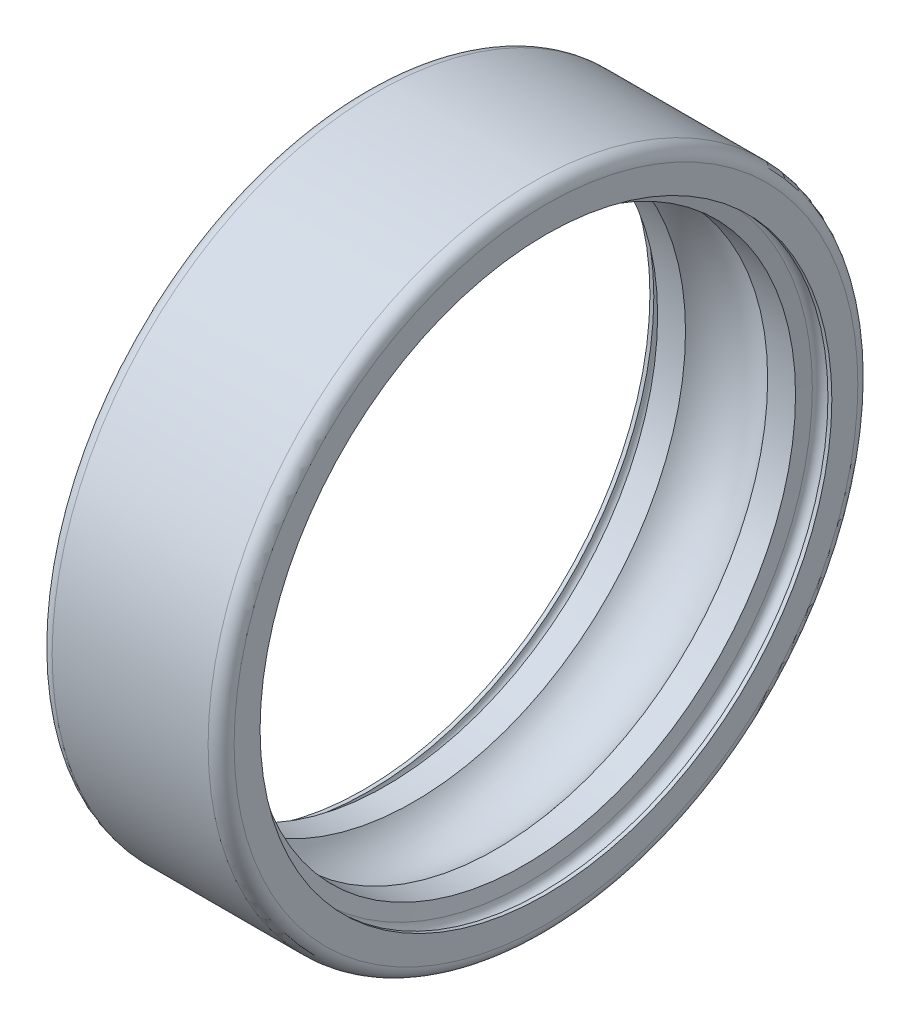
ISO-10303-21;
HEADER;
FILE_DESCRIPTION(('STEP AP214'),'2;1');
FILE_NAME('part.step','',(''),(''),'','','');
FILE_SCHEMA(('AUTOMOTIVE_DESIGN { 1 0 10303 214 1 1 1 1 }'));
ENDSEC;
DATA;
#1=APPLICATION_CONTEXT('core data for automotive mechanical design processes');
#2=APPLICATION_PROTOCOL_DEFINITION('international standard','automotive_design',2000,#1);
#3=PRODUCT_CONTEXT('',#1,'mechanical');
#4=PRODUCT('Part','Part','',(#3));
#5=PRODUCT_RELATED_PRODUCT_CATEGORY('part','',(#4));
#6=PRODUCT_DEFINITION_FORMATION('','',#4);
#7=PRODUCT_DEFINITION_CONTEXT('part definition',#1,'design');
#8=PRODUCT_DEFINITION('design','',#6,#7);
#9=PRODUCT_DEFINITION_SHAPE('','',#8);
#10=(LENGTH_UNIT() NAMED_UNIT(*) SI_UNIT(.MILLI.,.METRE.));
#11=(NAMED_UNIT(*) PLANE_ANGLE_UNIT() SI_UNIT($,.RADIAN.));
#12=(NAMED_UNIT(*) SI_UNIT($,.STERADIAN.) SOLID_ANGLE_UNIT());
#13=UNCERTAINTY_MEASURE_WITH_UNIT(LENGTH_MEASURE(1.E-05),#10,'distance_accuracy_value','');
#14=(GEOMETRIC_REPRESENTATION_CONTEXT(3) GLOBAL_UNCERTAINTY_ASSIGNED_CONTEXT((#13)) GLOBAL_UNIT_ASSIGNED_CONTEXT((#10,
#11,#12)) REPRESENTATION_CONTEXT('',''));
#15=CARTESIAN_POINT('',(0.,0.,0.));
#16=DIRECTION('',(0.,0.,1.));
#17=DIRECTION('',(1.,0.,0.));
#18=AXIS2_PLACEMENT_3D('',#15,#16,#17);
#19=CARTESIAN_POINT('',(0.,23.9999999999992,0.));
#20=DIRECTION('',(1.,0.,0.));
#21=DIRECTION('',(0.,0.,-1.));
#22=AXIS2_PLACEMENT_3D('',#19,#20,#21);
#23=PLANE('',#22);
#24=CARTESIAN_POINT('',(0.,0.,0.));
#25=DIRECTION('',(-1.,0.,0.));
#26=DIRECTION('',(0.,0.,1.));
#27=AXIS2_PLACEMENT_3D('',#24,#25,#26);
#28=CIRCLE('',#27,22.);
#29=CARTESIAN_POINT('',(0.,0.,22.));
#30=VERTEX_POINT('',#29);
#31=EDGE_CURVE('E10',#30,#30,#28,.T.);
#32=ORIENTED_EDGE('',*,*,#31,.F.);
#33=EDGE_LOOP('',(#32));
#34=FACE_BOUND('',#33,.T.);
#35=CARTESIAN_POINT('',(0.,0.,0.));
#36=DIRECTION('',(-1.,0.,0.));
#37=DIRECTION('',(0.,0.,1.));
#38=AXIS2_PLACEMENT_3D('',#35,#36,#37);
#39=CIRCLE('',#38,23.9999999999992);
#40=CARTESIAN_POINT('',(0.,0.,23.9999999999992));
#41=VERTEX_POINT('',#40);
#42=EDGE_CURVE('E81',#41,#41,#39,.T.);
#43=ORIENTED_EDGE('',*,*,#42,.T.);
#44=EDGE_LOOP('',(#43));
#45=FACE_BOUND('',#44,.T.);
#46=ADVANCED_FACE('F35',(#34,#45),#23,.F.);
#47=CARTESIAN_POINT('',(50.,0.,0.));
#48=DIRECTION('',(-1.,0.,0.));
#49=DIRECTION('',(0.,0.,1.));
#50=AXIS2_PLACEMENT_3D('',#47,#48,#49);
#51=CYLINDRICAL_SURFACE('',#50,22.);
#52=CARTESIAN_POINT('',(0.300000000000002,0.,0.));
#53=DIRECTION('',(-1.,0.,0.));
#54=DIRECTION('',(0.,0.,1.));
#55=AXIS2_PLACEMENT_3D('',#52,#53,#54);
#56=CIRCLE('',#55,22.);
#57=CARTESIAN_POINT('',(0.300000000000002,0.,22.));
#58=VERTEX_POINT('',#57);
#59=EDGE_CURVE('E41',#58,#58,#56,.T.);
#60=ORIENTED_EDGE('',*,*,#59,.F.);
#61=EDGE_LOOP('',(#60));
#62=FACE_BOUND('',#61,.T.);
#63=ORIENTED_EDGE('',*,*,#31,.T.);
#64=EDGE_LOOP('',(#63));
#65=FACE_BOUND('',#64,.T.);
#66=ADVANCED_FACE('F154',(#62,#65),#51,.F.);
#67=CARTESIAN_POINT('',(0.9,0.,0.));
#68=DIRECTION('',(-1.,0.,0.));
#69=DIRECTION('',(0.,0.,1.));
#70=AXIS2_PLACEMENT_3D('',#67,#68,#69);
#71=TOROIDAL_SURFACE('',#70,22.,0.6);
#72=CARTESIAN_POINT('',(1.5,0.,0.));
#73=DIRECTION('',(-1.,0.,0.));
#74=DIRECTION('',(0.,0.,1.));
#75=AXIS2_PLACEMENT_3D('',#72,#73,#74);
#76=CIRCLE('',#75,22.);
#77=CARTESIAN_POINT('',(1.5,0.,22.));
#78=VERTEX_POINT('',#77);
#79=EDGE_CURVE('E45',#78,#78,#76,.T.);
#80=ORIENTED_EDGE('',*,*,#79,.F.);
#81=EDGE_LOOP('',(#80));
#82=FACE_BOUND('',#81,.T.);
#83=ORIENTED_EDGE('',*,*,#59,.T.);
#84=EDGE_LOOP('',(#83));
#85=FACE_BOUND('',#84,.T.);
#86=ADVANCED_FACE('F149',(#82,#85),#71,.F.);
#87=CARTESIAN_POINT('',(1.5,0.,0.));
#88=DIRECTION('',(-1.,0.,0.));
#89=DIRECTION('',(0.,0.,1.));
#90=AXIS2_PLACEMENT_3D('',#87,#88,#89);
#91=CONICAL_SURFACE('',#90,22.,1.39626340159548);
#92=CARTESIAN_POINT('',(1.6939596787793,0.,0.));
#93=DIRECTION('',(-1.,0.,0.));
#94=DIRECTION('',(0.,0.,1.));
#95=AXIS2_PLACEMENT_3D('',#92,#93,#94);
#96=CIRCLE('',#95,20.9);
#97=CARTESIAN_POINT('',(1.6939596787793,0.,20.9));
#98=VERTEX_POINT('',#97);
#99=EDGE_CURVE('E49',#98,#98,#96,.T.);
#100=ORIENTED_EDGE('',*,*,#99,.F.);
#101=EDGE_LOOP('',(#100));
#102=FACE_BOUND('',#101,.T.);
#103=ORIENTED_EDGE('',*,*,#79,.T.);
#104=EDGE_LOOP('',(#103));
#105=FACE_BOUND('',#104,.T.);
#106=ADVANCED_FACE('F143',(#102,#105),#91,.F.);
#107=CARTESIAN_POINT('',(50.,0.,0.));
#108=DIRECTION('',(-1.,0.,0.));
#109=DIRECTION('',(0.,0.,1.));
#110=AXIS2_PLACEMENT_3D('',#107,#108,#109);
#111=CYLINDRICAL_SURFACE('',#110,20.9);
#112=CARTESIAN_POINT('',(3.8388354993769,0.,0.));
#113=DIRECTION('',(-1.,0.,0.));
#114=DIRECTION('',(0.,0.,1.));
#115=AXIS2_PLACEMENT_3D('',#112,#113,#114);
#116=CIRCLE('',#115,20.9);
#117=CARTESIAN_POINT('',(3.8388354993769,0.,20.9));
#118=VERTEX_POINT('',#117);
#119=EDGE_CURVE('E54',#118,#118,#116,.T.);
#120=ORIENTED_EDGE('',*,*,#119,.F.);
#121=EDGE_LOOP('',(#120));
#122=FACE_BOUND('',#121,.T.);
#123=ORIENTED_EDGE('',*,*,#99,.T.);
#124=EDGE_LOOP('',(#123));
#125=FACE_BOUND('',#124,.T.);
#126=ADVANCED_FACE('F137',(#122,#125),#111,.F.);
#127=CARTESIAN_POINT('',(6.99999999999995,0.,0.));
#128=DIRECTION('',(-1.,0.,0.));
#129=DIRECTION('',(0.,0.,1.));
#130=AXIS2_PLACEMENT_3D('',#127,#128,#129);
#131=TOROIDAL_SURFACE('',#130,18.5000000000002,3.9689999999998);
#132=CARTESIAN_POINT('',(10.161164500623,0.,0.));
#133=DIRECTION('',(-1.,0.,0.));
#134=DIRECTION('',(0.,0.,1.));
#135=AXIS2_PLACEMENT_3D('',#132,#133,#134);
#136=CIRCLE('',#135,20.9);
#137=CARTESIAN_POINT('',(10.161164500623,0.,20.9));
#138=VERTEX_POINT('',#137);
#139=EDGE_CURVE('E57',#138,#138,#136,.T.);
#140=ORIENTED_EDGE('',*,*,#139,.F.);
#141=EDGE_LOOP('',(#140));
#142=FACE_BOUND('',#141,.T.);
#143=ORIENTED_EDGE('',*,*,#119,.T.);
#144=EDGE_LOOP('',(#143));
#145=FACE_BOUND('',#144,.T.);
#146=ADVANCED_FACE('F131',(#142,#145),#131,.F.);
#147=CARTESIAN_POINT('',(50.,0.,0.));
#148=DIRECTION('',(-1.,0.,0.));
#149=DIRECTION('',(0.,0.,1.));
#150=AXIS2_PLACEMENT_3D('',#147,#148,#149);
#151=CYLINDRICAL_SURFACE('',#150,20.9);
#152=CARTESIAN_POINT('',(12.306040321221,0.,0.));
#153=DIRECTION('',(-1.,0.,0.));
#154=DIRECTION('',(0.,0.,1.));
#155=AXIS2_PLACEMENT_3D('',#152,#153,#154);
#156=CIRCLE('',#155,20.9);
#157=CARTESIAN_POINT('',(12.306040321221,0.,20.9));
#158=VERTEX_POINT('',#157);
#159=EDGE_CURVE('E60',#158,#158,#156,.T.);
#160=ORIENTED_EDGE('',*,*,#159,.F.);
#161=EDGE_LOOP('',(#160));
#162=FACE_BOUND('',#161,.T.);
#163=ORIENTED_EDGE('',*,*,#139,.T.);
#164=EDGE_LOOP('',(#163));
#165=FACE_BOUND('',#164,.T.);
#166=ADVANCED_FACE('F125',(#162,#165),#151,.F.);
#167=CARTESIAN_POINT('',(12.306040321221,0.,0.));
#168=DIRECTION('',(1.,0.,0.));
#169=DIRECTION('',(0.,0.,-1.));
#170=AXIS2_PLACEMENT_3D('',#167,#168,#169);
#171=CONICAL_SURFACE('',#170,20.9,1.39626340159574);
#172=CARTESIAN_POINT('',(12.5,0.,0.));
#173=DIRECTION('',(-1.,0.,0.));
#174=DIRECTION('',(0.,0.,1.));
#175=AXIS2_PLACEMENT_3D('',#172,#173,#174);
#176=CIRCLE('',#175,22.);
#177=CARTESIAN_POINT('',(12.5,0.,22.));
#178=VERTEX_POINT('',#177);
#179=EDGE_CURVE('E63',#178,#178,#176,.T.);
#180=ORIENTED_EDGE('',*,*,#179,.F.);
#181=EDGE_LOOP('',(#180));
#182=FACE_BOUND('',#181,.T.);
#183=ORIENTED_EDGE('',*,*,#159,.T.);
#184=EDGE_LOOP('',(#183));
#185=FACE_BOUND('',#184,.T.);
#186=ADVANCED_FACE('F119',(#182,#185),#171,.F.);
#187=CARTESIAN_POINT('',(13.1,0.,0.));
#188=DIRECTION('',(-1.,0.,0.));
#189=DIRECTION('',(0.,0.,1.));
#190=AXIS2_PLACEMENT_3D('',#187,#188,#189);
#191=TOROIDAL_SURFACE('',#190,22.,0.600000000000001);
#192=CARTESIAN_POINT('',(13.7,0.,0.));
#193=DIRECTION('',(-1.,0.,0.));
#194=DIRECTION('',(0.,0.,1.));
#195=AXIS2_PLACEMENT_3D('',#192,#193,#194);
#196=CIRCLE('',#195,22.);
#197=CARTESIAN_POINT('',(13.7,0.,22.));
#198=VERTEX_POINT('',#197);
#199=EDGE_CURVE('E66',#198,#198,#196,.T.);
#200=ORIENTED_EDGE('',*,*,#199,.F.);
#201=EDGE_LOOP('',(#200));
#202=FACE_BOUND('',#201,.T.);
#203=ORIENTED_EDGE('',*,*,#179,.T.);
#204=EDGE_LOOP('',(#203));
#205=FACE_BOUND('',#204,.T.);
#206=ADVANCED_FACE('F113',(#202,#205),#191,.F.);
#207=CARTESIAN_POINT('',(50.,0.,0.));
#208=DIRECTION('',(-1.,0.,0.));
#209=DIRECTION('',(0.,0.,1.));
#210=AXIS2_PLACEMENT_3D('',#207,#208,#209);
#211=CYLINDRICAL_SURFACE('',#210,22.);
#212=CARTESIAN_POINT('',(14.,0.,0.));
#213=DIRECTION('',(-1.,0.,0.));
#214=DIRECTION('',(0.,0.,1.));
#215=AXIS2_PLACEMENT_3D('',#212,#213,#214);
#216=CIRCLE('',#215,22.);
#217=CARTESIAN_POINT('',(14.,0.,22.));
#218=VERTEX_POINT('',#217);
#219=EDGE_CURVE('E69',#218,#218,#216,.T.);
#220=ORIENTED_EDGE('',*,*,#219,.F.);
#221=EDGE_LOOP('',(#220));
#222=FACE_BOUND('',#221,.T.);
#223=ORIENTED_EDGE('',*,*,#199,.T.);
#224=EDGE_LOOP('',(#223));
#225=FACE_BOUND('',#224,.T.);
#226=ADVANCED_FACE('F107',(#222,#225),#211,.F.);
#227=CARTESIAN_POINT('',(14.,22.,0.));
#228=DIRECTION('',(-1.,0.,0.));
#229=DIRECTION('',(0.,0.,1.));
#230=AXIS2_PLACEMENT_3D('',#227,#228,#229);
#231=PLANE('',#230);
#232=CARTESIAN_POINT('',(14.,0.,0.));
#233=DIRECTION('',(-1.,0.,0.));
#234=DIRECTION('',(0.,0.,1.));
#235=AXIS2_PLACEMENT_3D('',#232,#233,#234);
#236=CIRCLE('',#235,24.);
#237=CARTESIAN_POINT('',(14.,0.,24.));
#238=VERTEX_POINT('',#237);
#239=EDGE_CURVE('E72',#238,#238,#236,.T.);
#240=ORIENTED_EDGE('',*,*,#239,.F.);
#241=EDGE_LOOP('',(#240));
#242=FACE_BOUND('',#241,.T.);
#243=ORIENTED_EDGE('',*,*,#219,.T.);
#244=EDGE_LOOP('',(#243));
#245=FACE_BOUND('',#244,.T.);
#246=ADVANCED_FACE('F101',(#242,#245),#231,.F.);
#247=CARTESIAN_POINT('',(13.0000000000016,0.,0.));
#248=DIRECTION('',(-1.,0.,0.));
#249=DIRECTION('',(0.,0.,1.));
#250=AXIS2_PLACEMENT_3D('',#247,#248,#249);
#251=TOROIDAL_SURFACE('',#250,24.0000000000015,0.999999999998452);
#252=CARTESIAN_POINT('',(13.,0.,0.));
#253=DIRECTION('',(-1.,0.,0.));
#254=DIRECTION('',(0.,0.,1.));
#255=AXIS2_PLACEMENT_3D('',#252,#253,#254);
#256=CIRCLE('',#255,25.);
#257=CARTESIAN_POINT('',(13.,0.,25.));
#258=VERTEX_POINT('',#257);
#259=EDGE_CURVE('E75',#258,#258,#256,.T.);
#260=ORIENTED_EDGE('',*,*,#259,.F.);
#261=EDGE_LOOP('',(#260));
#262=FACE_BOUND('',#261,.T.);
#263=ORIENTED_EDGE('',*,*,#239,.T.);
#264=EDGE_LOOP('',(#263));
#265=FACE_BOUND('',#264,.T.);
#266=ADVANCED_FACE('F95',(#262,#265),#251,.T.);
#267=CARTESIAN_POINT('',(50.,0.,0.));
#268=DIRECTION('',(-1.,0.,0.));
#269=DIRECTION('',(0.,0.,1.));
#270=AXIS2_PLACEMENT_3D('',#267,#268,#269);
#271=CYLINDRICAL_SURFACE('',#270,25.);
#272=CARTESIAN_POINT('',(1.,0.,0.));
#273=DIRECTION('',(-1.,0.,0.));
#274=DIRECTION('',(0.,0.,1.));
#275=AXIS2_PLACEMENT_3D('',#272,#273,#274);
#276=CIRCLE('',#275,25.);
#277=CARTESIAN_POINT('',(1.,0.,25.));
#278=VERTEX_POINT('',#277);
#279=EDGE_CURVE('E78',#278,#278,#276,.T.);
#280=ORIENTED_EDGE('',*,*,#279,.F.);
#281=EDGE_LOOP('',(#280));
#282=FACE_BOUND('',#281,.T.);
#283=ORIENTED_EDGE('',*,*,#259,.T.);
#284=EDGE_LOOP('',(#283));
#285=FACE_BOUND('',#284,.T.);
#286=ADVANCED_FACE('F89',(#282,#285),#271,.T.);
#287=CARTESIAN_POINT('',(0.999999999999219,0.,0.));
#288=DIRECTION('',(-1.,0.,0.));
#289=DIRECTION('',(0.,0.,1.));
#290=AXIS2_PLACEMENT_3D('',#287,#288,#289);
#291=TOROIDAL_SURFACE('',#290,24.0000000000008,0.99999999999922);
#292=ORIENTED_EDGE('',*,*,#42,.F.);
#293=EDGE_LOOP('',(#292));
#294=FACE_BOUND('',#293,.T.);
#295=ORIENTED_EDGE('',*,*,#279,.T.);
#296=EDGE_LOOP('',(#295));
#297=FACE_BOUND('',#296,.T.);
#298=ADVANCED_FACE('F86',(#294,#297),#291,.T.);
#299=CLOSED_SHELL('',(#46,#66,#86,#106,#126,#146,#166,#186,#206,#226,#246,#266,#286,#298));
#300=MANIFOLD_SOLID_BREP('B2',#299);
#301=ADVANCED_BREP_SHAPE_REPRESENTATION('',(#18,#300),#14);
#302=SHAPE_DEFINITION_REPRESENTATION(#9,#301);
ENDSEC;
END-ISO-10303-21;
